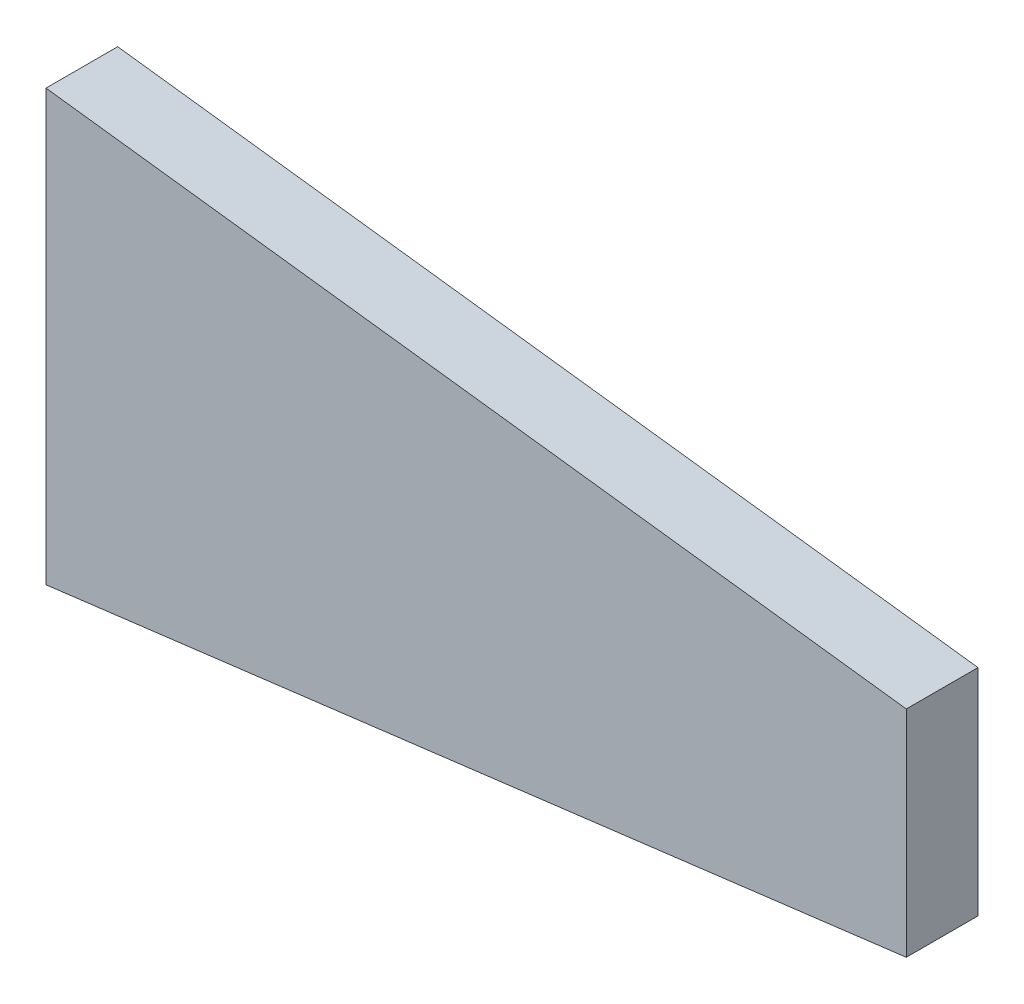
ISO-10303-21;
HEADER;
FILE_DESCRIPTION(('STEP AP214'),'2;1');
FILE_NAME('part.step','',(''),(''),'','','');
FILE_SCHEMA(('AUTOMOTIVE_DESIGN { 1 0 10303 214 1 1 1 1 }'));
ENDSEC;
DATA;
#1=APPLICATION_CONTEXT('core data for automotive mechanical design processes');
#2=APPLICATION_PROTOCOL_DEFINITION('international standard','automotive_design',2000,#1);
#3=PRODUCT_CONTEXT('',#1,'mechanical');
#4=PRODUCT('Part','Part','',(#3));
#5=PRODUCT_RELATED_PRODUCT_CATEGORY('part','',(#4));
#6=PRODUCT_DEFINITION_FORMATION('','',#4);
#7=PRODUCT_DEFINITION_CONTEXT('part definition',#1,'design');
#8=PRODUCT_DEFINITION('design','',#6,#7);
#9=PRODUCT_DEFINITION_SHAPE('','',#8);
#10=(LENGTH_UNIT() NAMED_UNIT(*) SI_UNIT(.MILLI.,.METRE.));
#11=(NAMED_UNIT(*) PLANE_ANGLE_UNIT() SI_UNIT($,.RADIAN.));
#12=(NAMED_UNIT(*) SI_UNIT($,.STERADIAN.) SOLID_ANGLE_UNIT());
#13=UNCERTAINTY_MEASURE_WITH_UNIT(LENGTH_MEASURE(1.E-05),#10,'distance_accuracy_value','');
#14=(GEOMETRIC_REPRESENTATION_CONTEXT(3) GLOBAL_UNCERTAINTY_ASSIGNED_CONTEXT((#13)) GLOBAL_UNIT_ASSIGNED_CONTEXT((#10,
#11,#12)) REPRESENTATION_CONTEXT('',''));
#15=CARTESIAN_POINT('',(0.,0.,0.));
#16=DIRECTION('',(0.,0.,1.));
#17=DIRECTION('',(1.,0.,0.));
#18=AXIS2_PLACEMENT_3D('',#15,#16,#17);
#19=CARTESIAN_POINT('',(-76.2,-38.1,12.7));
#20=DIRECTION('',(1.,0.,0.));
#21=DIRECTION('',(0.,1.,0.));
#22=AXIS2_PLACEMENT_3D('',#19,#20,#21);
#23=PLANE('',#22);
#24=DIRECTION('',(0.,-1.,0.));
#25=VECTOR('',#24,1.);
#26=CARTESIAN_POINT('',(-76.2,-38.1,0.));
#27=LINE('',#26,#25);
#28=CARTESIAN_POINT('',(-76.2,38.1,0.));
#29=VERTEX_POINT('',#28);
#30=CARTESIAN_POINT('',(-76.2,-38.1,0.));
#31=VERTEX_POINT('',#30);
#32=EDGE_CURVE('E95',#29,#31,#27,.T.);
#33=ORIENTED_EDGE('',*,*,#32,.T.);
#34=DIRECTION('',(0.,0.,-1.));
#35=VECTOR('',#34,1.);
#36=CARTESIAN_POINT('',(-76.2,-38.1,12.7));
#37=LINE('',#36,#35);
#38=CARTESIAN_POINT('',(-76.2,-38.1,12.7));
#39=VERTEX_POINT('',#38);
#40=EDGE_CURVE('E11',#39,#31,#37,.T.);
#41=ORIENTED_EDGE('',*,*,#40,.F.);
#42=DIRECTION('',(0.,-1.,0.));
#43=VECTOR('',#42,1.);
#44=CARTESIAN_POINT('',(-76.2,-38.1,12.7));
#45=LINE('',#44,#43);
#46=CARTESIAN_POINT('',(-76.2,38.1,12.7));
#47=VERTEX_POINT('',#46);
#48=EDGE_CURVE('E83',#47,#39,#45,.T.);
#49=ORIENTED_EDGE('',*,*,#48,.F.);
#50=DIRECTION('',(0.,0.,-1.));
#51=VECTOR('',#50,1.);
#52=CARTESIAN_POINT('',(-76.2,38.1,12.7));
#53=LINE('',#52,#51);
#54=EDGE_CURVE('E91',#47,#29,#53,.T.);
#55=ORIENTED_EDGE('',*,*,#54,.T.);
#56=EDGE_LOOP('',(#33,#41,#49,#55));
#57=FACE_BOUND('',#56,.T.);
#58=ADVANCED_FACE('F32',(#57),#23,.F.);
#59=CARTESIAN_POINT('',(76.2,-19.05,12.7));
#60=DIRECTION('',(-0.124034734589209,0.992277876713668,0.));
#61=DIRECTION('',(-0.992277876713668,-0.124034734589209,0.));
#62=AXIS2_PLACEMENT_3D('',#59,#60,#61);
#63=PLANE('',#62);
#64=DIRECTION('',(0.992277876713668,0.124034734589208,0.));
#65=VECTOR('',#64,1.);
#66=CARTESIAN_POINT('',(76.2,-19.05,0.));
#67=LINE('',#66,#65);
#68=CARTESIAN_POINT('',(76.2,-19.05,0.));
#69=VERTEX_POINT('',#68);
#70=EDGE_CURVE('E87',#31,#69,#67,.T.);
#71=ORIENTED_EDGE('',*,*,#70,.T.);
#72=DIRECTION('',(0.,0.,-1.));
#73=VECTOR('',#72,1.);
#74=CARTESIAN_POINT('',(76.2,-19.05,12.7));
#75=LINE('',#74,#73);
#76=CARTESIAN_POINT('',(76.2,-19.05,12.7));
#77=VERTEX_POINT('',#76);
#78=EDGE_CURVE('E40',#77,#69,#75,.T.);
#79=ORIENTED_EDGE('',*,*,#78,.F.);
#80=DIRECTION('',(0.992277876713668,0.124034734589208,0.));
#81=VECTOR('',#80,1.);
#82=CARTESIAN_POINT('',(76.2,-19.05,12.7));
#83=LINE('',#82,#81);
#84=EDGE_CURVE('E78',#39,#77,#83,.T.);
#85=ORIENTED_EDGE('',*,*,#84,.F.);
#86=ORIENTED_EDGE('',*,*,#40,.T.);
#87=EDGE_LOOP('',(#71,#79,#85,#86));
#88=FACE_BOUND('',#87,.T.);
#89=ADVANCED_FACE('F86',(#88),#63,.F.);
#90=CARTESIAN_POINT('',(76.2,19.05,12.7));
#91=DIRECTION('',(-1.,0.,0.));
#92=DIRECTION('',(0.,0.,1.));
#93=AXIS2_PLACEMENT_3D('',#90,#91,#92);
#94=PLANE('',#93);
#95=DIRECTION('',(0.,1.,0.));
#96=VECTOR('',#95,1.);
#97=CARTESIAN_POINT('',(76.2,19.05,0.));
#98=LINE('',#97,#96);
#99=CARTESIAN_POINT('',(76.2,19.05,0.));
#100=VERTEX_POINT('',#99);
#101=EDGE_CURVE('E65',#69,#100,#98,.T.);
#102=ORIENTED_EDGE('',*,*,#101,.T.);
#103=DIRECTION('',(0.,0.,-1.));
#104=VECTOR('',#103,1.);
#105=CARTESIAN_POINT('',(76.2,19.05,12.7));
#106=LINE('',#105,#104);
#107=CARTESIAN_POINT('',(76.2,19.05,12.7));
#108=VERTEX_POINT('',#107);
#109=EDGE_CURVE('E88',#108,#100,#106,.T.);
#110=ORIENTED_EDGE('',*,*,#109,.F.);
#111=DIRECTION('',(0.,1.,0.));
#112=VECTOR('',#111,1.);
#113=CARTESIAN_POINT('',(76.2,19.05,12.7));
#114=LINE('',#113,#112);
#115=EDGE_CURVE('E81',#77,#108,#114,.T.);
#116=ORIENTED_EDGE('',*,*,#115,.F.);
#117=ORIENTED_EDGE('',*,*,#78,.T.);
#118=EDGE_LOOP('',(#102,#110,#116,#117));
#119=FACE_BOUND('',#118,.T.);
#120=ADVANCED_FACE('F89',(#119),#94,.F.);
#121=CARTESIAN_POINT('',(-76.2,38.1,12.7));
#122=DIRECTION('',(-0.124034734589208,-0.992277876713668,0.));
#123=DIRECTION('',(0.992277876713668,-0.124034734589208,0.));
#124=AXIS2_PLACEMENT_3D('',#121,#122,#123);
#125=PLANE('',#124);
#126=DIRECTION('',(-0.992277876713668,0.124034734589208,0.));
#127=VECTOR('',#126,1.);
#128=CARTESIAN_POINT('',(-76.2,38.1,0.));
#129=LINE('',#128,#127);
#130=EDGE_CURVE('E71',#100,#29,#129,.T.);
#131=ORIENTED_EDGE('',*,*,#130,.T.);
#132=ORIENTED_EDGE('',*,*,#54,.F.);
#133=DIRECTION('',(-0.992277876713668,0.124034734589208,0.));
#134=VECTOR('',#133,1.);
#135=CARTESIAN_POINT('',(-76.2,38.1,12.7));
#136=LINE('',#135,#134);
#137=EDGE_CURVE('E48',#108,#47,#136,.T.);
#138=ORIENTED_EDGE('',*,*,#137,.F.);
#139=ORIENTED_EDGE('',*,*,#109,.T.);
#140=EDGE_LOOP('',(#131,#132,#138,#139));
#141=FACE_BOUND('',#140,.T.);
#142=ADVANCED_FACE('F102',(#141),#125,.F.);
#143=CARTESIAN_POINT('',(0.,0.,12.7));
#144=DIRECTION('',(0.,0.,-1.));
#145=DIRECTION('',(-1.,0.,0.));
#146=AXIS2_PLACEMENT_3D('',#143,#144,#145);
#147=PLANE('',#146);
#148=ORIENTED_EDGE('',*,*,#48,.T.);
#149=ORIENTED_EDGE('',*,*,#84,.T.);
#150=ORIENTED_EDGE('',*,*,#115,.T.);
#151=ORIENTED_EDGE('',*,*,#137,.T.);
#152=EDGE_LOOP('',(#148,#149,#150,#151));
#153=FACE_BOUND('',#152,.T.);
#154=ADVANCED_FACE('F79',(#153),#147,.F.);
#155=CARTESIAN_POINT('',(0.,0.,0.));
#156=DIRECTION('',(0.,0.,-1.));
#157=DIRECTION('',(-1.,0.,0.));
#158=AXIS2_PLACEMENT_3D('',#155,#156,#157);
#159=PLANE('',#158);
#160=ORIENTED_EDGE('',*,*,#32,.F.);
#161=ORIENTED_EDGE('',*,*,#130,.F.);
#162=ORIENTED_EDGE('',*,*,#101,.F.);
#163=ORIENTED_EDGE('',*,*,#70,.F.);
#164=EDGE_LOOP('',(#160,#161,#162,#163));
#165=FACE_BOUND('',#164,.T.);
#166=ADVANCED_FACE('F105',(#165),#159,.T.);
#167=CLOSED_SHELL('',(#58,#89,#120,#142,#154,#166));
#168=MANIFOLD_SOLID_BREP('B2',#167);
#169=ADVANCED_BREP_SHAPE_REPRESENTATION('',(#18,#168),#14);
#170=SHAPE_DEFINITION_REPRESENTATION(#9,#169);
ENDSEC;
END-ISO-10303-21;
